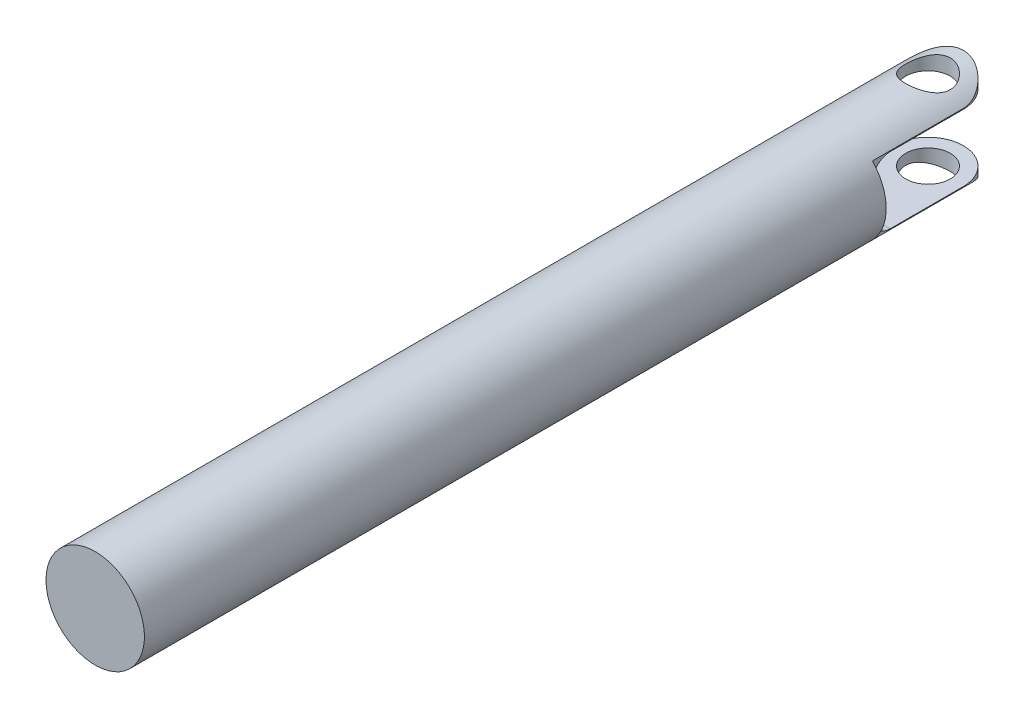
ISO-10303-21;
HEADER;
FILE_DESCRIPTION(('STEP AP214'),'2;1');
FILE_NAME('part.step','',(''),(''),'','','');
FILE_SCHEMA(('AUTOMOTIVE_DESIGN { 1 0 10303 214 1 1 1 1 }'));
ENDSEC;
DATA;
#1=APPLICATION_CONTEXT('core data for automotive mechanical design processes');
#2=APPLICATION_PROTOCOL_DEFINITION('international standard','automotive_design',2000,#1);
#3=PRODUCT_CONTEXT('',#1,'mechanical');
#4=PRODUCT('Part','Part','',(#3));
#5=PRODUCT_RELATED_PRODUCT_CATEGORY('part','',(#4));
#6=PRODUCT_DEFINITION_FORMATION('','',#4);
#7=PRODUCT_DEFINITION_CONTEXT('part definition',#1,'design');
#8=PRODUCT_DEFINITION('design','',#6,#7);
#9=PRODUCT_DEFINITION_SHAPE('','',#8);
#10=(LENGTH_UNIT() NAMED_UNIT(*) SI_UNIT(.MILLI.,.METRE.));
#11=(NAMED_UNIT(*) PLANE_ANGLE_UNIT() SI_UNIT($,.RADIAN.));
#12=(NAMED_UNIT(*) SI_UNIT($,.STERADIAN.) SOLID_ANGLE_UNIT());
#13=UNCERTAINTY_MEASURE_WITH_UNIT(LENGTH_MEASURE(1.E-05),#10,'distance_accuracy_value','');
#14=(GEOMETRIC_REPRESENTATION_CONTEXT(3) GLOBAL_UNCERTAINTY_ASSIGNED_CONTEXT((#13)) GLOBAL_UNIT_ASSIGNED_CONTEXT((#10,
#11,#12)) REPRESENTATION_CONTEXT('',''));
#15=CARTESIAN_POINT('',(0.,0.,0.));
#16=DIRECTION('',(0.,0.,1.));
#17=DIRECTION('',(1.,0.,0.));
#18=AXIS2_PLACEMENT_3D('',#15,#16,#17);
#19=CARTESIAN_POINT('',(715.852281931826,264.343054411073,18.1189841955734));
#20=DIRECTION('',(0.,1.,0.));
#21=DIRECTION('',(0.,0.,1.));
#22=AXIS2_PLACEMENT_3D('',#19,#20,#21);
#23=PLANE('',#22);
#24=CARTESIAN_POINT('',(706.62430407127,264.343054411073,22.4955493916067));
#25=DIRECTION('',(0.,1.,0.));
#26=DIRECTION('',(0.,0.,1.));
#27=AXIS2_PLACEMENT_3D('',#24,#25,#26);
#28=CIRCLE('',#27,1.5875);
#29=CARTESIAN_POINT('',(706.62430407127,264.343054411073,24.0830493916067));
#30=VERTEX_POINT('',#29);
#31=EDGE_CURVE('E153',#30,#30,#28,.T.);
#32=ORIENTED_EDGE('',*,*,#31,.T.);
#33=EDGE_LOOP('',(#32));
#34=FACE_BOUND('',#33,.T.);
#35=DIRECTION('',(-1.,0.,0.));
#36=VECTOR('',#35,1.);
#37=CARTESIAN_POINT('',(715.852281931826,264.343054411073,27.7138377391523));
#38=LINE('',#37,#36);
#39=CARTESIAN_POINT('',(709.146192852539,264.343054411073,27.7138377391523));
#40=VERTEX_POINT('',#39);
#41=CARTESIAN_POINT('',(704.10241529,264.343054411073,27.7138377391523));
#42=VERTEX_POINT('',#41);
#43=EDGE_CURVE('E150',#40,#42,#38,.T.);
#44=ORIENTED_EDGE('',*,*,#43,.T.);
#45=DIRECTION('',(0.,0.,-1.));
#46=VECTOR('',#45,1.);
#47=CARTESIAN_POINT('',(704.10241529,264.343054411073,22.4955493916067));
#48=LINE('',#47,#46);
#49=CARTESIAN_POINT('',(704.10241529,264.343054411073,22.4955493916067));
#50=VERTEX_POINT('',#49);
#51=EDGE_CURVE('E226',#42,#50,#48,.T.);
#52=ORIENTED_EDGE('',*,*,#51,.T.);
#53=CARTESIAN_POINT('',(706.62430407127,264.343054411073,22.4955493916067));
#54=DIRECTION('',(0.,1.,0.));
#55=DIRECTION('',(0.,0.,1.));
#56=AXIS2_PLACEMENT_3D('',#53,#54,#55);
#57=CIRCLE('',#56,2.52188878126947);
#58=CARTESIAN_POINT('',(706.548691910645,264.343054411073,19.9747943804526));
#59=VERTEX_POINT('',#58);
#60=EDGE_CURVE('E232',#50,#59,#57,.F.);
#61=ORIENTED_EDGE('',*,*,#60,.T.);
#62=DIRECTION('',(1.,0.,0.));
#63=VECTOR('',#62,1.);
#64=CARTESIAN_POINT('',(706.62430407127,264.343054411073,19.9747943804526));
#65=LINE('',#64,#63);
#66=CARTESIAN_POINT('',(706.699916231894,264.343054411073,19.9747943804526));
#67=VERTEX_POINT('',#66);
#68=EDGE_CURVE('E132',#59,#67,#65,.T.);
#69=ORIENTED_EDGE('',*,*,#68,.T.);
#70=CARTESIAN_POINT('',(706.62430407127,264.343054411073,22.4955493916067));
#71=DIRECTION('',(0.,1.,0.));
#72=DIRECTION('',(0.,0.,1.));
#73=AXIS2_PLACEMENT_3D('',#70,#71,#72);
#74=CIRCLE('',#73,2.52188878126947);
#75=CARTESIAN_POINT('',(709.146192852539,264.343054411073,22.4955493916067));
#76=VERTEX_POINT('',#75);
#77=EDGE_CURVE('E20',#67,#76,#74,.F.);
#78=ORIENTED_EDGE('',*,*,#77,.T.);
#79=DIRECTION('',(0.,0.,1.));
#80=VECTOR('',#79,1.);
#81=CARTESIAN_POINT('',(709.146192852539,264.343054411073,28.9838377391524));
#82=LINE('',#81,#80);
#83=EDGE_CURVE('E120',#76,#40,#82,.T.);
#84=ORIENTED_EDGE('',*,*,#83,.T.);
#85=EDGE_LOOP('',(#44,#52,#61,#69,#78,#84));
#86=FACE_BOUND('',#85,.T.);
#87=ADVANCED_FACE('F17',(#34,#86),#23,.F.);
#88=CARTESIAN_POINT('',(709.146192852539,252.498307150052,28.9838377391524));
#89=DIRECTION('',(-1.,0.,0.));
#90=DIRECTION('',(0.,0.,1.));
#91=AXIS2_PLACEMENT_3D('',#88,#89,#90);
#92=PLANE('',#91);
#93=ORIENTED_EDGE('',*,*,#83,.F.);
#94=DIRECTION('',(0.,1.,0.));
#95=VECTOR('',#94,1.);
#96=CARTESIAN_POINT('',(709.146192852539,252.498307150052,22.4955493916067));
#97=LINE('',#96,#95);
#98=CARTESIAN_POINT('',(709.146192852539,264.401909531112,22.4955493916067));
#99=VERTEX_POINT('',#98);
#100=EDGE_CURVE('E123',#76,#99,#97,.T.);
#101=ORIENTED_EDGE('',*,*,#100,.T.);
#102=DIRECTION('',(0.,0.,-1.));
#103=VECTOR('',#102,1.);
#104=CARTESIAN_POINT('',(709.146192852539,264.401909531112,81.8847543804526));
#105=LINE('',#104,#103);
#106=CARTESIAN_POINT('',(709.146192852539,264.401909531112,28.9838377391524));
#107=VERTEX_POINT('',#106);
#108=EDGE_CURVE('E247',#107,#99,#105,.T.);
#109=ORIENTED_EDGE('',*,*,#108,.F.);
#110=DIRECTION('',(0.,1.,0.));
#111=VECTOR('',#110,1.);
#112=CARTESIAN_POINT('',(709.146192852539,252.498307150052,28.9838377391523));
#113=LINE('',#112,#111);
#114=CARTESIAN_POINT('',(709.146192852539,263.073054411073,28.9838377391523));
#115=VERTEX_POINT('',#114);
#116=EDGE_CURVE('E129',#115,#107,#113,.T.);
#117=ORIENTED_EDGE('',*,*,#116,.F.);
#118=CARTESIAN_POINT('',(709.146192852539,263.073054411073,27.7138377391523));
#119=DIRECTION('',(-1.,0.,0.));
#120=DIRECTION('',(0.,0.,1.));
#121=AXIS2_PLACEMENT_3D('',#118,#119,#120);
#122=CIRCLE('',#121,1.27000000000001);
#123=EDGE_CURVE('E126',#115,#40,#122,.T.);
#124=ORIENTED_EDGE('',*,*,#123,.T.);
#125=EDGE_LOOP('',(#93,#101,#109,#117,#124));
#126=FACE_BOUND('',#125,.T.);
#127=ADVANCED_FACE('F121',(#126),#92,.F.);
#128=CARTESIAN_POINT('',(706.62430407127,264.343054411073,22.4955493916067));
#129=DIRECTION('',(0.,1.,0.));
#130=DIRECTION('',(0.,0.,1.));
#131=AXIS2_PLACEMENT_3D('',#128,#129,#130);
#132=CYLINDRICAL_SURFACE('',#131,2.52188878126947);
#133=DIRECTION('',(0.,1.,0.));
#134=VECTOR('',#133,1.);
#135=CARTESIAN_POINT('',(706.699916231894,261.961804411073,19.9747943804526));
#136=LINE('',#135,#134);
#137=CARTESIAN_POINT('',(706.699916231895,265.470125779349,19.9747943804526));
#138=VERTEX_POINT('',#137);
#139=EDGE_CURVE('E134',#67,#138,#136,.T.);
#140=ORIENTED_EDGE('',*,*,#139,.T.);
#141=CARTESIAN_POINT('',(709.146192852539,264.401909531112,22.4955493916067));
#142=CARTESIAN_POINT('',(709.146210846639,264.401867759245,22.4351059403807));
#143=CARTESIAN_POINT('',(709.144020695179,264.404154313488,22.3746900506629));
#144=CARTESIAN_POINT('',(709.135370540585,264.413059054684,22.2545887956424));
#145=CARTESIAN_POINT('',(709.128918010426,264.419669660335,22.1949023376706));
#146=CARTESIAN_POINT('',(709.111987828302,264.436799189149,22.0774084945787));
#147=CARTESIAN_POINT('',(709.101557951821,264.447271676336,22.0195873182296));
#148=CARTESIAN_POINT('',(709.076887639095,264.471619604504,21.9054932496051));
#149=CARTESIAN_POINT('',(709.062645700606,264.48549638686,21.8492209773792));
#150=CARTESIAN_POINT('',(709.014765941022,264.531173452414,21.6839462899591));
#151=CARTESIAN_POINT('',(708.975839821224,264.567166129655,21.5775931322377));
#152=CARTESIAN_POINT('',(708.885330500621,264.646094312908,21.372926656004));
#153=CARTESIAN_POINT('',(708.833704811736,264.689052956567,21.2746418345038));
#154=CARTESIAN_POINT('',(708.708195135422,264.786489406734,21.069241395572));
#155=CARTESIAN_POINT('',(708.631958694483,264.841625811675,20.9638695995181));
#156=CARTESIAN_POINT('',(708.464184491097,264.951618283822,20.7659156087025));
#157=CARTESIAN_POINT('',(708.372636449338,265.006474137014,20.6733420827264));
#158=CARTESIAN_POINT('',(708.156773478554,265.121396912518,20.4867557938782));
#159=CARTESIAN_POINT('',(708.029526922381,265.180610940894,20.3955130635561));
#160=CARTESIAN_POINT('',(707.825047919472,265.259927986,20.2764598039438));
#161=CARTESIAN_POINT('',(707.75467884761,265.284767683646,20.2397650527835));
#162=CARTESIAN_POINT('',(707.6097707179,265.330579268079,20.172806980718));
#163=CARTESIAN_POINT('',(707.535235392429,265.351554546691,20.1425380162716));
#164=CARTESIAN_POINT('',(707.399177849029,265.384872573456,20.0948191323584));
#165=CARTESIAN_POINT('',(707.338343366746,265.398100832177,20.0760128449909));
#166=CARTESIAN_POINT('',(707.214879682694,265.421457818205,20.0429537513668));
#167=CARTESIAN_POINT('',(707.152251091106,265.431587585946,20.0286994165518));
#168=CARTESIAN_POINT('',(707.02514241806,265.448565058508,20.0048747814631));
#169=CARTESIAN_POINT('',(706.960651578126,265.455386041103,19.995342605341));
#170=CARTESIAN_POINT('',(706.830790265802,265.465470506049,19.9812747772127));
#171=CARTESIAN_POINT('',(706.765418998562,265.468730520379,19.9767439960125));
#172=CARTESIAN_POINT('',(706.699916231895,265.470125779349,19.9747943804526));
#173=B_SPLINE_CURVE_WITH_KNOTS('',3,(#141,#142,#143,#144,#145,#146,#147,#148,#149,#150,#151,
#152,#153,#154,#155,#156,#157,#158,#159,#160,#161,#162,#163,#164,#165,#166,#167,#168,#169,#170,
#171,#172),.UNSPECIFIED.,.F.,.F.,(4,2,2,2,2,2,2,2,2,2,2,2,2,2,2,4),(0.,0.18120320027378,
0.362089547945063,0.540868263792676,0.719717536175043,1.07470774756271,1.43090217544286,
1.85316975117854,2.27572195897852,2.77472624456074,3.0238490126667,3.27275207149792,
3.46762018297402,3.66242278821265,3.85877348575763,4.05531523893904),.UNSPECIFIED.);
#174=EDGE_CURVE('E137',#99,#138,#173,.T.);
#175=ORIENTED_EDGE('',*,*,#174,.F.);
#176=ORIENTED_EDGE('',*,*,#100,.F.);
#177=ORIENTED_EDGE('',*,*,#77,.F.);
#178=EDGE_LOOP('',(#140,#175,#176,#177));
#179=FACE_BOUND('',#178,.T.);
#180=ADVANCED_FACE('F135',(#179),#132,.T.);
#181=CARTESIAN_POINT('',(706.62430407127,261.961804411073,19.9747943804526));
#182=DIRECTION('',(0.,0.,1.));
#183=DIRECTION('',(1.,0.,0.));
#184=AXIS2_PLACEMENT_3D('',#181,#182,#183);
#185=PLANE('',#184);
#186=DIRECTION('',(0.,1.,0.));
#187=VECTOR('',#186,1.);
#188=CARTESIAN_POINT('',(706.548691910646,252.498307150052,19.9747943804526));
#189=LINE('',#188,#187);
#190=CARTESIAN_POINT('',(706.548691910645,265.470125779349,19.9747943804526));
#191=VERTEX_POINT('',#190);
#192=EDGE_CURVE('E154',#59,#191,#189,.T.);
#193=ORIENTED_EDGE('',*,*,#192,.T.);
#194=CARTESIAN_POINT('',(706.62430407127,261.961804411073,19.9747943804526));
#195=DIRECTION('',(0.,0.,-1.));
#196=DIRECTION('',(-1.,0.,0.));
#197=AXIS2_PLACEMENT_3D('',#194,#195,#196);
#198=CIRCLE('',#197,3.509136079142);
#199=EDGE_CURVE('E202',#138,#191,#198,.F.);
#200=ORIENTED_EDGE('',*,*,#199,.F.);
#201=ORIENTED_EDGE('',*,*,#139,.F.);
#202=ORIENTED_EDGE('',*,*,#68,.F.);
#203=EDGE_LOOP('',(#193,#200,#201,#202));
#204=FACE_BOUND('',#203,.T.);
#205=ADVANCED_FACE('F209',(#204),#185,.F.);
#206=CARTESIAN_POINT('',(706.62430407127,264.343054411073,22.4955493916067));
#207=DIRECTION('',(0.,1.,0.));
#208=DIRECTION('',(0.,0.,1.));
#209=AXIS2_PLACEMENT_3D('',#206,#207,#208);
#210=CYLINDRICAL_SURFACE('',#209,2.52188878126947);
#211=DIRECTION('',(0.,1.,0.));
#212=VECTOR('',#211,1.);
#213=CARTESIAN_POINT('',(704.10241529,252.498307150052,22.4955493916067));
#214=LINE('',#213,#212);
#215=CARTESIAN_POINT('',(704.10241529,264.401909531112,22.4955493916067));
#216=VERTEX_POINT('',#215);
#217=EDGE_CURVE('E233',#50,#216,#214,.T.);
#218=ORIENTED_EDGE('',*,*,#217,.T.);
#219=CARTESIAN_POINT('',(706.548691910644,265.470125779349,19.9747943804526));
#220=CARTESIAN_POINT('',(706.485367772663,265.468775163411,19.9766808403384));
#221=CARTESIAN_POINT('',(706.422166223794,265.465684075923,19.9809774131935));
#222=CARTESIAN_POINT('',(706.296554611758,265.456164779915,19.9942553860524));
#223=CARTESIAN_POINT('',(706.234144020111,265.449738934613,20.0032334684656));
#224=CARTESIAN_POINT('',(706.110977998598,265.433744671081,20.0256677122464));
#225=CARTESIAN_POINT('',(706.050214354919,265.424197306183,20.0390938810031));
#226=CARTESIAN_POINT('',(705.930346651275,265.402179116675,20.0702277092493));
#227=CARTESIAN_POINT('',(705.871242813756,265.389707902288,20.0879359395903));
#228=CARTESIAN_POINT('',(705.69728655396,265.348367971547,20.1470386361362));
#229=CARTESIAN_POINT('',(705.585366874782,265.315515368032,20.1944901516153));
#230=CARTESIAN_POINT('',(705.371555590756,265.241668732653,20.3035173812863));
#231=CARTESIAN_POINT('',(705.269676607208,265.200664644671,20.3651105560942));
#232=CARTESIAN_POINT('',(705.067541581397,265.108870931517,20.507294679052));
#233=CARTESIAN_POINT('',(704.96844602199,265.057514320313,20.5891631361369));
#234=CARTESIAN_POINT('',(704.784316143431,264.951750180262,20.7661753154863));
#235=CARTESIAN_POINT('',(704.69931620924,264.897335612065,20.861350486366));
#236=CARTESIAN_POINT('',(704.576092048572,264.811712446467,21.0223197583642));
#237=CARTESIAN_POINT('',(704.532959244788,264.780118700004,21.0842015986885));
#238=CARTESIAN_POINT('',(704.452133081701,264.71830644032,21.212064165544));
#239=CARTESIAN_POINT('',(704.414441882716,264.688088476528,21.2780465051844));
#240=CARTESIAN_POINT('',(704.310350691054,264.601449167197,21.4813678006669));
#241=CARTESIAN_POINT('',(704.252287730166,264.548569560754,21.6249157510598));
#242=CARTESIAN_POINT('',(704.190606394839,264.489987165675,21.8318116915011));
#243=CARTESIAN_POINT('',(704.175596274476,264.475408246212,21.8894570547283));
#244=CARTESIAN_POINT('',(704.149581866782,264.449798434764,22.0064115563498));
#245=CARTESIAN_POINT('',(704.138575145388,264.438765387369,22.0657196600917));
#246=CARTESIAN_POINT('',(704.120690237221,264.42069222051,22.1863586016849));
#247=CARTESIAN_POINT('',(704.113866719049,264.413705037583,22.2477056157815));
#248=CARTESIAN_POINT('',(704.104714661813,264.404285739881,22.3712063772439));
#249=CARTESIAN_POINT('',(704.102395607047,264.401863236512,22.4333615499992));
#250=CARTESIAN_POINT('',(704.10241529,264.401909531112,22.4955493916067));
#251=B_SPLINE_CURVE_WITH_KNOTS('',3,(#219,#220,#221,#222,#223,#224,#225,#226,#227,#228,#229,
#230,#231,#232,#233,#234,#235,#236,#237,#238,#239,#240,#241,#242,#243,#244,#245,#246,#247,#248,
#249,#250),.UNSPECIFIED.,.F.,.F.,(4,2,2,2,2,2,2,2,2,2,2,2,2,2,2,4),(0.,0.190010508382326,
0.37988654686477,0.568507494909452,0.757153602326619,1.13316143011061,1.50963603298845,
1.92340399741726,2.33816691742723,2.58322234062998,2.82837478486535,3.31525113685259,
3.49904016859202,3.68271726922967,3.86874627038612,4.05516653906208),.UNSPECIFIED.);
#252=EDGE_CURVE('E195',#191,#216,#251,.T.);
#253=ORIENTED_EDGE('',*,*,#252,.F.);
#254=ORIENTED_EDGE('',*,*,#192,.F.);
#255=ORIENTED_EDGE('',*,*,#60,.F.);
#256=EDGE_LOOP('',(#218,#253,#254,#255));
#257=FACE_BOUND('',#256,.T.);
#258=ADVANCED_FACE('F203',(#257),#210,.T.);
#259=CARTESIAN_POINT('',(704.10241529,252.498307150052,22.4955493916067));
#260=DIRECTION('',(1.,0.,0.));
#261=DIRECTION('',(0.,0.,-1.));
#262=AXIS2_PLACEMENT_3D('',#259,#260,#261);
#263=PLANE('',#262);
#264=CARTESIAN_POINT('',(704.10241529,263.073054411073,27.7138377391523));
#265=DIRECTION('',(-1.,0.,0.));
#266=DIRECTION('',(0.,0.,1.));
#267=AXIS2_PLACEMENT_3D('',#264,#265,#266);
#268=CIRCLE('',#267,1.27000000000001);
#269=CARTESIAN_POINT('',(704.10241529,263.073054411073,28.9838377391523));
#270=VERTEX_POINT('',#269);
#271=EDGE_CURVE('E152',#42,#270,#268,.F.);
#272=ORIENTED_EDGE('',*,*,#271,.T.);
#273=DIRECTION('',(0.,1.,0.));
#274=VECTOR('',#273,1.);
#275=CARTESIAN_POINT('',(704.10241529,252.498307150052,28.9838377391523));
#276=LINE('',#275,#274);
#277=CARTESIAN_POINT('',(704.10241529,264.401909531112,28.9838377391523));
#278=VERTEX_POINT('',#277);
#279=EDGE_CURVE('E229',#278,#270,#276,.F.);
#280=ORIENTED_EDGE('',*,*,#279,.F.);
#281=DIRECTION('',(0.,0.,-1.));
#282=VECTOR('',#281,1.);
#283=CARTESIAN_POINT('',(704.10241529,264.401909531112,81.8847543804526));
#284=LINE('',#283,#282);
#285=EDGE_CURVE('E201',#216,#278,#284,.F.);
#286=ORIENTED_EDGE('',*,*,#285,.F.);
#287=ORIENTED_EDGE('',*,*,#217,.F.);
#288=ORIENTED_EDGE('',*,*,#51,.F.);
#289=EDGE_LOOP('',(#272,#280,#286,#287,#288));
#290=FACE_BOUND('',#289,.T.);
#291=ADVANCED_FACE('F208',(#290),#263,.F.);
#292=CARTESIAN_POINT('',(706.62430407127,252.498307150052,22.4955493916067));
#293=DIRECTION('',(0.,1.,0.));
#294=DIRECTION('',(0.,0.,1.));
#295=AXIS2_PLACEMENT_3D('',#292,#293,#294);
#296=CYLINDRICAL_SURFACE('',#295,1.5875);
#297=CARTESIAN_POINT('',(705.03680407127,265.091321909336,22.4955493916067));
#298=CARTESIAN_POINT('',(705.036809297307,265.091327908607,22.4115820058948));
#299=CARTESIAN_POINT('',(705.043502683489,265.094747820734,22.327551788926));
#300=CARTESIAN_POINT('',(705.069963580269,265.10795563778,22.1620388173801));
#301=CARTESIAN_POINT('',(705.089748899335,265.117752216343,22.0805596912883));
#302=CARTESIAN_POINT('',(705.141425383632,265.142356986035,21.922754700116));
#303=CARTESIAN_POINT('',(705.173266355512,265.157144370742,21.8464089934469));
#304=CARTESIAN_POINT('',(705.247993568841,265.190034031202,21.7001389753699));
#305=CARTESIAN_POINT('',(705.290881529738,265.208136822866,21.6302156658998));
#306=CARTESIAN_POINT('',(705.389849989792,265.247100037533,21.4936219615741));
#307=CARTESIAN_POINT('',(705.446620210057,265.268063883843,21.4274805991702));
#308=CARTESIAN_POINT('',(705.570296101999,265.309543409977,21.3052611316833));
#309=CARTESIAN_POINT('',(705.637205500741,265.33005892181,21.249186743751));
#310=CARTESIAN_POINT('',(705.783590829141,265.369630057491,21.1458092699024));
#311=CARTESIAN_POINT('',(705.863543626755,265.388551479213,21.0991253356223));
#312=CARTESIAN_POINT('',(706.031182160602,265.421503935707,21.0201051392256));
#313=CARTESIAN_POINT('',(706.118863917745,265.435537468691,20.9877615454125));
#314=CARTESIAN_POINT('',(706.29388652581,265.456393658141,20.9403324308913));
#315=CARTESIAN_POINT('',(706.380931554506,265.463598784059,20.9243270456709));
#316=CARTESIAN_POINT('',(706.556749177441,265.471391374626,20.9070329581297));
#317=CARTESIAN_POINT('',(706.645520918942,265.471982026685,20.9057371674811));
#318=CARTESIAN_POINT('',(706.815493128911,265.46668670082,20.9174683973777));
#319=CARTESIAN_POINT('',(706.896781070098,265.461260844712,20.9294778234641));
#320=CARTESIAN_POINT('',(707.056041431706,265.445200276084,20.9657031416353));
#321=CARTESIAN_POINT('',(707.134013612477,265.434565187753,20.9899199144009));
#322=CARTESIAN_POINT('',(707.285873516932,265.408888368911,21.0501227596505));
#323=CARTESIAN_POINT('',(707.359681307853,265.393782219417,21.0862818471544));
#324=CARTESIAN_POINT('',(707.500372726207,265.360594219389,21.1691511774781));
#325=CARTESIAN_POINT('',(707.567253987663,265.34251135749,21.2158650083841));
#326=CARTESIAN_POINT('',(707.697949477332,265.303412206666,21.3228856485243));
#327=CARTESIAN_POINT('',(707.761079249012,265.282276953335,21.3839857911276));
#328=CARTESIAN_POINT('',(707.876539306098,265.240481312105,21.5158802802252));
#329=CARTESIAN_POINT('',(707.928861375083,265.219821296025,21.586681934654));
#330=CARTESIAN_POINT('',(708.023455508569,265.18036907689,21.7399049865195));
#331=CARTESIAN_POINT('',(708.065169043752,265.161702844518,21.8227060152369));
#332=CARTESIAN_POINT('',(708.133716424506,265.129951807389,21.9951541494402));
#333=CARTESIAN_POINT('',(708.160582907213,265.116854775025,22.0847857419107));
#334=CARTESIAN_POINT('',(708.190128588758,265.102244210038,22.2286915851946));
#335=CARTESIAN_POINT('',(708.19823938785,265.098171811196,22.2816458992678));
#336=CARTESIAN_POINT('',(708.209078647824,265.09270881908,22.3882414098064));
#337=CARTESIAN_POINT('',(708.211807411433,265.091318074969,22.4418825674676));
#338=CARTESIAN_POINT('',(708.211798845232,265.091327908607,22.5795167773186));
#339=CARTESIAN_POINT('',(708.20510545905,265.094747820734,22.6635469942873));
#340=CARTESIAN_POINT('',(708.17864456227,265.10795563778,22.8290599658333));
#341=CARTESIAN_POINT('',(708.158859243204,265.117752216343,22.9105390919251));
#342=CARTESIAN_POINT('',(708.107182758908,265.142356986035,23.0683440830974));
#343=CARTESIAN_POINT('',(708.075341787027,265.157144370742,23.1446897897665));
#344=CARTESIAN_POINT('',(708.000614573699,265.190034031202,23.2909598078435));
#345=CARTESIAN_POINT('',(707.957726612801,265.208136822866,23.3608831173135));
#346=CARTESIAN_POINT('',(707.858758152748,265.247100037533,23.4974768216393));
#347=CARTESIAN_POINT('',(707.801987932482,265.268063883843,23.5636181840432));
#348=CARTESIAN_POINT('',(707.67831204054,265.309543409977,23.6858376515301));
#349=CARTESIAN_POINT('',(707.611402641799,265.33005892181,23.7419120394623));
#350=CARTESIAN_POINT('',(707.465017313398,265.369630057491,23.845289513311));
#351=CARTESIAN_POINT('',(707.385064515784,265.388551479213,23.8919734475911));
#352=CARTESIAN_POINT('',(707.217425981937,265.421503935707,23.9709936439878));
#353=CARTESIAN_POINT('',(707.129744224795,265.435537468691,24.0033372378009));
#354=CARTESIAN_POINT('',(706.95472161673,265.456393658141,24.0507663523221));
#355=CARTESIAN_POINT('',(706.867676588033,265.463598784059,24.0667717375424));
#356=CARTESIAN_POINT('',(706.691858965099,265.471391374626,24.0840658250836));
#357=CARTESIAN_POINT('',(706.603087223597,265.471982026685,24.0853616157322));
#358=CARTESIAN_POINT('',(706.433115013628,265.46668670082,24.0736303858357));
#359=CARTESIAN_POINT('',(706.351827072441,265.461260844712,24.0616209597493));
#360=CARTESIAN_POINT('',(706.192566710833,265.445200276084,24.025395641578));
#361=CARTESIAN_POINT('',(706.114594530063,265.434565187753,24.0011788688125));
#362=CARTESIAN_POINT('',(705.962734625608,265.408888368911,23.9409760235629));
#363=CARTESIAN_POINT('',(705.888926834686,265.393782219417,23.904816936059));
#364=CARTESIAN_POINT('',(705.748235416332,265.360594219389,23.8219476057353));
#365=CARTESIAN_POINT('',(705.681354154877,265.34251135749,23.7752337748292));
#366=CARTESIAN_POINT('',(705.550658665208,265.303412206666,23.668213134689));
#367=CARTESIAN_POINT('',(705.487528893528,265.282276953335,23.6071129920857));
#368=CARTESIAN_POINT('',(705.372068836441,265.240481312105,23.4752185029881));
#369=CARTESIAN_POINT('',(705.319746767456,265.219821296025,23.4044168485593));
#370=CARTESIAN_POINT('',(705.22515263397,265.18036907689,23.2511937966939));
#371=CARTESIAN_POINT('',(705.183439098787,265.161702844518,23.1683927679765));
#372=CARTESIAN_POINT('',(705.114891718033,265.129951807389,22.995944633773));
#373=CARTESIAN_POINT('',(705.088025235326,265.116854775025,22.9063130413026));
#374=CARTESIAN_POINT('',(705.058479553781,265.102244210038,22.7624071980187));
#375=CARTESIAN_POINT('',(705.05036875469,265.098171811196,22.7094528839455));
#376=CARTESIAN_POINT('',(705.039529494716,265.09270881908,22.6028573734069));
#377=CARTESIAN_POINT('',(705.036800731106,265.091318074969,22.5492162157457));
#378=CARTESIAN_POINT('',(705.03680407127,265.091321909336,22.4955493916067));
#379=B_SPLINE_CURVE_WITH_KNOTS('',3,(#297,#298,#299,#300,#301,#302,#303,#304,#305,#306,#307,
#308,#309,#310,#311,#312,#313,#314,#315,#316,#317,#318,#319,#320,#321,#322,#323,#324,#325,#326,
#327,#328,#329,#330,#331,#332,#333,#334,#335,#336,#337,#338,#339,#340,#341,#342,#343,#344,#345,
#346,#347,#348,#349,#350,#351,#352,#353,#354,#355,#356,#357,#358,#359,#360,#361,#362,#363,#364,
#365,#366,#367,#368,#369,#370,#371,#372,#373,#374,#375,#376,#377,#378),.UNSPECIFIED.,.T.,.F.,(4,
2,2,2,2,2,2,2,2,2,2,2,2,2,2,2,2,2,2,2,2,2,2,2,2,2,2,2,2,2,2,2,2,2,2,2,2,2,2,2,4),(0.,
0.251687633919703,0.503718334889148,0.754711051038043,1.00574285749613,1.27353807023167,
1.54143196176887,1.82346518897505,2.10535405606965,2.37031237069136,2.63514300054715,
2.88103565783032,3.12694605721051,3.37658798087479,3.62631489836888,3.89621968903549,
4.1663289223132,4.44859905380822,4.73024619896211,4.89111861020772,5.05198197248844,
5.30366960640816,5.55570030737762,5.8066930235265,6.05772482998459,6.32552004272013,
6.59341393425732,6.8754471614635,7.1573360285581,7.4222943431798,7.6871249730356,
7.93301763031876,8.17892802969896,8.42856995336324,8.67829687085747,8.94820166152393,
9.21831089480172,9.50058102629674,9.78222817145066,9.94310058269623,10.1039639449769),.UNSPECIFIED.);
#380=CARTESIAN_POINT('',(705.03680407127,265.091321909336,22.4955493916067));
#381=VERTEX_POINT('',#380);
#382=EDGE_CURVE('E181',#381,#381,#379,.T.);
#383=ORIENTED_EDGE('',*,*,#382,.F.);
#384=EDGE_LOOP('',(#383));
#385=FACE_BOUND('',#384,.T.);
#386=ORIENTED_EDGE('',*,*,#31,.F.);
#387=EDGE_LOOP('',(#386));
#388=FACE_BOUND('',#387,.T.);
#389=ADVANCED_FACE('F320',(#385,#388),#296,.F.);
#390=CARTESIAN_POINT('',(715.852281931826,263.073054411073,27.7138377391523));
#391=DIRECTION('',(-1.,0.,0.));
#392=DIRECTION('',(0.,0.,1.));
#393=AXIS2_PLACEMENT_3D('',#390,#391,#392);
#394=CYLINDRICAL_SURFACE('',#393,1.27000000000001);
#395=DIRECTION('',(1.,0.,0.));
#396=VECTOR('',#395,1.);
#397=CARTESIAN_POINT('',(720.175677525395,263.073054411073,28.9838377391523));
#398=LINE('',#397,#396);
#399=EDGE_CURVE('E145',#115,#270,#398,.F.);
#400=ORIENTED_EDGE('',*,*,#399,.T.);
#401=ORIENTED_EDGE('',*,*,#271,.F.);
#402=ORIENTED_EDGE('',*,*,#43,.F.);
#403=ORIENTED_EDGE('',*,*,#123,.F.);
#404=EDGE_LOOP('',(#400,#401,#402,#403));
#405=FACE_BOUND('',#404,.T.);
#406=ADVANCED_FACE('F317',(#405),#394,.F.);
#407=CARTESIAN_POINT('',(715.852281931826,260.850554411073,27.7138377391523));
#408=DIRECTION('',(-1.,0.,0.));
#409=DIRECTION('',(0.,0.,1.));
#410=AXIS2_PLACEMENT_3D('',#407,#408,#409);
#411=CYLINDRICAL_SURFACE('',#410,1.27);
#412=DIRECTION('',(1.,0.,0.));
#413=VECTOR('',#412,1.);
#414=CARTESIAN_POINT('',(715.852281931826,259.580554411073,27.7138377391523));
#415=LINE('',#414,#413);
#416=CARTESIAN_POINT('',(709.146192852539,259.580554411073,27.7138377391523));
#417=VERTEX_POINT('',#416);
#418=CARTESIAN_POINT('',(704.10241529,259.580554411073,27.7138377391523));
#419=VERTEX_POINT('',#418);
#420=EDGE_CURVE('E245',#417,#419,#415,.F.);
#421=ORIENTED_EDGE('',*,*,#420,.T.);
#422=CARTESIAN_POINT('',(704.10241529,260.850554411073,27.7138377391523));
#423=DIRECTION('',(-1.,0.,0.));
#424=DIRECTION('',(0.,0.,1.));
#425=AXIS2_PLACEMENT_3D('',#422,#423,#424);
#426=CIRCLE('',#425,1.27);
#427=CARTESIAN_POINT('',(704.10241529,260.850554411073,28.9838377391524));
#428=VERTEX_POINT('',#427);
#429=EDGE_CURVE('E257',#419,#428,#426,.T.);
#430=ORIENTED_EDGE('',*,*,#429,.T.);
#431=DIRECTION('',(1.,0.,0.));
#432=VECTOR('',#431,1.);
#433=CARTESIAN_POINT('',(720.175677525395,260.850554411073,28.9838377391524));
#434=LINE('',#433,#432);
#435=CARTESIAN_POINT('',(709.146192852539,260.850554411073,28.9838377391524));
#436=VERTEX_POINT('',#435);
#437=EDGE_CURVE('E248',#428,#436,#434,.T.);
#438=ORIENTED_EDGE('',*,*,#437,.T.);
#439=CARTESIAN_POINT('',(709.146192852539,260.850554411073,27.7138377391523));
#440=DIRECTION('',(-1.,0.,0.));
#441=DIRECTION('',(0.,0.,1.));
#442=AXIS2_PLACEMENT_3D('',#439,#440,#441);
#443=CIRCLE('',#442,1.27);
#444=EDGE_CURVE('E149',#436,#417,#443,.F.);
#445=ORIENTED_EDGE('',*,*,#444,.T.);
#446=EDGE_LOOP('',(#421,#430,#438,#445));
#447=FACE_BOUND('',#446,.T.);
#448=ADVANCED_FACE('F313',(#447),#411,.F.);
#449=CARTESIAN_POINT('',(715.852281931826,259.580554411073,27.7138377391523));
#450=DIRECTION('',(0.,-1.,0.));
#451=DIRECTION('',(0.,0.,-1.));
#452=AXIS2_PLACEMENT_3D('',#449,#450,#451);
#453=PLANE('',#452);
#454=CARTESIAN_POINT('',(706.62430407127,259.580554411073,22.4955493916067));
#455=DIRECTION('',(0.,1.,0.));
#456=DIRECTION('',(0.,0.,1.));
#457=AXIS2_PLACEMENT_3D('',#454,#455,#456);
#458=CIRCLE('',#457,1.5875);
#459=CARTESIAN_POINT('',(706.62430407127,259.580554411073,24.0830493916067));
#460=VERTEX_POINT('',#459);
#461=EDGE_CURVE('E270',#460,#460,#458,.F.);
#462=ORIENTED_EDGE('',*,*,#461,.T.);
#463=EDGE_LOOP('',(#462));
#464=FACE_BOUND('',#463,.T.);
#465=CARTESIAN_POINT('',(706.62430407127,259.580554411073,22.4955493916067));
#466=DIRECTION('',(0.,1.,0.));
#467=DIRECTION('',(0.,0.,1.));
#468=AXIS2_PLACEMENT_3D('',#465,#466,#467);
#469=CIRCLE('',#468,2.52188878126947);
#470=CARTESIAN_POINT('',(709.146192852539,259.580554411073,22.4955493916067));
#471=VERTEX_POINT('',#470);
#472=CARTESIAN_POINT('',(706.699916231894,259.580554411073,19.9747943804526));
#473=VERTEX_POINT('',#472);
#474=EDGE_CURVE('E262',#471,#473,#469,.T.);
#475=ORIENTED_EDGE('',*,*,#474,.T.);
#476=DIRECTION('',(1.,0.,0.));
#477=VECTOR('',#476,1.);
#478=CARTESIAN_POINT('',(706.62430407127,259.580554411073,19.9747943804526));
#479=LINE('',#478,#477);
#480=CARTESIAN_POINT('',(706.548691910645,259.580554411073,19.9747943804526));
#481=VERTEX_POINT('',#480);
#482=EDGE_CURVE('E240',#473,#481,#479,.F.);
#483=ORIENTED_EDGE('',*,*,#482,.T.);
#484=CARTESIAN_POINT('',(706.62430407127,259.580554411073,22.4955493916067));
#485=DIRECTION('',(0.,1.,0.));
#486=DIRECTION('',(0.,0.,1.));
#487=AXIS2_PLACEMENT_3D('',#484,#485,#486);
#488=CIRCLE('',#487,2.52188878126947);
#489=CARTESIAN_POINT('',(704.10241529,259.580554411073,22.4955493916067));
#490=VERTEX_POINT('',#489);
#491=EDGE_CURVE('E259',#481,#490,#488,.T.);
#492=ORIENTED_EDGE('',*,*,#491,.T.);
#493=DIRECTION('',(0.,0.,-1.));
#494=VECTOR('',#493,1.);
#495=CARTESIAN_POINT('',(704.10241529,259.580554411073,22.4955493916067));
#496=LINE('',#495,#494);
#497=EDGE_CURVE('E253',#490,#419,#496,.F.);
#498=ORIENTED_EDGE('',*,*,#497,.T.);
#499=ORIENTED_EDGE('',*,*,#420,.F.);
#500=DIRECTION('',(0.,0.,1.));
#501=VECTOR('',#500,1.);
#502=CARTESIAN_POINT('',(709.146192852539,259.580554411073,28.9838377391524));
#503=LINE('',#502,#501);
#504=EDGE_CURVE('E265',#417,#471,#503,.F.);
#505=ORIENTED_EDGE('',*,*,#504,.T.);
#506=EDGE_LOOP('',(#475,#483,#492,#498,#499,#505));
#507=FACE_BOUND('',#506,.T.);
#508=ADVANCED_FACE('F309',(#464,#507),#453,.F.);
#509=CARTESIAN_POINT('',(706.62430407127,261.961804411073,81.8847543804526));
#510=DIRECTION('',(0.,0.,1.));
#511=DIRECTION('',(1.,0.,0.));
#512=AXIS2_PLACEMENT_3D('',#509,#510,#511);
#513=PLANE('',#512);
#514=CARTESIAN_POINT('',(706.62430407127,261.961804411073,81.8847543804526));
#515=DIRECTION('',(0.,0.,-1.));
#516=DIRECTION('',(-1.,0.,0.));
#517=AXIS2_PLACEMENT_3D('',#514,#515,#516);
#518=CIRCLE('',#517,3.509136079142);
#519=CARTESIAN_POINT('',(703.115167992128,261.961804411073,81.8847543804526));
#520=VERTEX_POINT('',#519);
#521=EDGE_CURVE('E342',#520,#520,#518,.T.);
#522=ORIENTED_EDGE('',*,*,#521,.F.);
#523=EDGE_LOOP('',(#522));
#524=FACE_BOUND('',#523,.T.);
#525=ADVANCED_FACE('F305',(#524),#513,.T.);
#526=CARTESIAN_POINT('',(704.10241529,252.498307150052,22.4955493916067));
#527=DIRECTION('',(1.,0.,0.));
#528=DIRECTION('',(0.,0.,-1.));
#529=AXIS2_PLACEMENT_3D('',#526,#527,#528);
#530=PLANE('',#529);
#531=DIRECTION('',(0.,1.,0.));
#532=VECTOR('',#531,1.);
#533=CARTESIAN_POINT('',(704.10241529,252.498307150052,22.4955493916067));
#534=LINE('',#533,#532);
#535=CARTESIAN_POINT('',(704.10241529,259.521699291033,22.4955493916067));
#536=VERTEX_POINT('',#535);
#537=EDGE_CURVE('E256',#490,#536,#534,.F.);
#538=ORIENTED_EDGE('',*,*,#537,.T.);
#539=DIRECTION('',(0.,0.,-1.));
#540=VECTOR('',#539,1.);
#541=CARTESIAN_POINT('',(704.10241529,259.521699291033,81.8847543804526));
#542=LINE('',#541,#540);
#543=CARTESIAN_POINT('',(704.10241529,259.521699291033,28.9838377391524));
#544=VERTEX_POINT('',#543);
#545=EDGE_CURVE('E271',#544,#536,#542,.T.);
#546=ORIENTED_EDGE('',*,*,#545,.F.);
#547=DIRECTION('',(0.,-1.,0.));
#548=VECTOR('',#547,1.);
#549=CARTESIAN_POINT('',(704.10241529,252.498307150052,28.9838377391524));
#550=LINE('',#549,#548);
#551=EDGE_CURVE('E148',#544,#428,#550,.F.);
#552=ORIENTED_EDGE('',*,*,#551,.T.);
#553=ORIENTED_EDGE('',*,*,#429,.F.);
#554=ORIENTED_EDGE('',*,*,#497,.F.);
#555=EDGE_LOOP('',(#538,#546,#552,#553,#554));
#556=FACE_BOUND('',#555,.T.);
#557=ADVANCED_FACE('F301',(#556),#530,.F.);
#558=CARTESIAN_POINT('',(706.62430407127,258.446720614587,22.4955493916067));
#559=DIRECTION('',(0.,1.,0.));
#560=DIRECTION('',(0.,0.,1.));
#561=AXIS2_PLACEMENT_3D('',#558,#559,#560);
#562=CYLINDRICAL_SURFACE('',#561,2.52188878126947);
#563=DIRECTION('',(0.,1.,0.));
#564=VECTOR('',#563,1.);
#565=CARTESIAN_POINT('',(706.548691910646,261.961804411073,19.9747943804526));
#566=LINE('',#565,#564);
#567=CARTESIAN_POINT('',(706.548691910646,258.453483042797,19.9747943804526));
#568=VERTEX_POINT('',#567);
#569=EDGE_CURVE('E244',#481,#568,#566,.F.);
#570=ORIENTED_EDGE('',*,*,#569,.T.);
#571=CARTESIAN_POINT('',(704.10241529,259.521699291033,22.4955493916067));
#572=CARTESIAN_POINT('',(704.1023972959,259.521741062901,22.4351059403808));
#573=CARTESIAN_POINT('',(704.10458744736,259.519454508657,22.3746900506629));
#574=CARTESIAN_POINT('',(704.113237601955,259.510549767462,22.2545887956424));
#575=CARTESIAN_POINT('',(704.119690132113,259.50393916181,22.1949023376706));
#576=CARTESIAN_POINT('',(704.136620314237,259.486809632996,22.0774084945788));
#577=CARTESIAN_POINT('',(704.147050190719,259.47633714581,22.0195873182296));
#578=CARTESIAN_POINT('',(704.171720503444,259.451989217641,21.9054932496052));
#579=CARTESIAN_POINT('',(704.185962441933,259.438112435285,21.8492209773793));
#580=CARTESIAN_POINT('',(704.233842201517,259.392435369732,21.6839462899591));
#581=CARTESIAN_POINT('',(704.272768321315,259.35644269249,21.5775931322377));
#582=CARTESIAN_POINT('',(704.363277641919,259.277514509237,21.3729266560041));
#583=CARTESIAN_POINT('',(704.414903330804,259.234555865578,21.2746418345038));
#584=CARTESIAN_POINT('',(704.540413007117,259.137119415412,21.069241395572));
#585=CARTESIAN_POINT('',(704.616649448056,259.081983010471,20.9638695995181));
#586=CARTESIAN_POINT('',(704.784423651442,258.971990538323,20.7659156087025));
#587=CARTESIAN_POINT('',(704.875971693201,258.917134685131,20.6733420827264));
#588=CARTESIAN_POINT('',(705.091834663986,258.802211909628,20.4867557938782));
#589=CARTESIAN_POINT('',(705.219081220158,258.742997881252,20.3955130635561));
#590=CARTESIAN_POINT('',(705.423560223067,258.663680836145,20.2764598039438));
#591=CARTESIAN_POINT('',(705.493929294929,258.638841138499,20.2397650527835));
#592=CARTESIAN_POINT('',(705.638837424639,258.593029554067,20.172806980718));
#593=CARTESIAN_POINT('',(705.713372750111,258.572054275455,20.1425380162717));
#594=CARTESIAN_POINT('',(705.849430293511,258.53873624869,20.0948191323585));
#595=CARTESIAN_POINT('',(705.910264775794,258.525507989968,20.0760128449909));
#596=CARTESIAN_POINT('',(706.033728459846,258.50215100394,20.0429537513667));
#597=CARTESIAN_POINT('',(706.096357051434,258.492021236199,20.0286994165517));
#598=CARTESIAN_POINT('',(706.22346572448,258.475043763637,20.004874781463));
#599=CARTESIAN_POINT('',(706.287956564415,258.468222781042,19.9953426053409));
#600=CARTESIAN_POINT('',(706.417817876738,258.458138316096,19.9812747772126));
#601=CARTESIAN_POINT('',(706.483189143979,258.454878301766,19.9767439960125));
#602=CARTESIAN_POINT('',(706.548691910645,258.453483042797,19.9747943804526));
#603=B_SPLINE_CURVE_WITH_KNOTS('',3,(#571,#572,#573,#574,#575,#576,#577,#578,#579,#580,#581,
#582,#583,#584,#585,#586,#587,#588,#589,#590,#591,#592,#593,#594,#595,#596,#597,#598,#599,#600,
#601,#602),.UNSPECIFIED.,.F.,.F.,(4,2,2,2,2,2,2,2,2,2,2,2,2,2,2,4),(0.,0.181203200273777,
0.362089547945067,0.540868263792683,0.71971753617504,1.07470774756271,1.43090217544285,
1.85316975117855,2.27572195897851,2.77472624456074,3.02384901266669,3.2727520714979,
3.46762018297436,3.66242278821332,3.85877348575863,4.05531523894036),.UNSPECIFIED.);
#604=EDGE_CURVE('E171',#536,#568,#603,.T.);
#605=ORIENTED_EDGE('',*,*,#604,.F.);
#606=ORIENTED_EDGE('',*,*,#537,.F.);
#607=ORIENTED_EDGE('',*,*,#491,.F.);
#608=EDGE_LOOP('',(#570,#605,#606,#607));
#609=FACE_BOUND('',#608,.T.);
#610=ADVANCED_FACE('F296',(#609),#562,.T.);
#611=CARTESIAN_POINT('',(706.62430407127,261.961804411073,19.9747943804526));
#612=DIRECTION('',(0.,0.,1.));
#613=DIRECTION('',(1.,0.,0.));
#614=AXIS2_PLACEMENT_3D('',#611,#612,#613);
#615=PLANE('',#614);
#616=DIRECTION('',(0.,1.,0.));
#617=VECTOR('',#616,1.);
#618=CARTESIAN_POINT('',(706.699916231894,252.498307150052,19.9747943804526));
#619=LINE('',#618,#617);
#620=CARTESIAN_POINT('',(706.699916231894,258.453483042797,19.9747943804526));
#621=VERTEX_POINT('',#620);
#622=EDGE_CURVE('E243',#473,#621,#619,.F.);
#623=ORIENTED_EDGE('',*,*,#622,.T.);
#624=CARTESIAN_POINT('',(706.62430407127,261.961804411073,19.9747943804526));
#625=DIRECTION('',(0.,0.,-1.));
#626=DIRECTION('',(-1.,0.,0.));
#627=AXIS2_PLACEMENT_3D('',#624,#625,#626);
#628=CIRCLE('',#627,3.509136079142);
#629=EDGE_CURVE('E280',#568,#621,#628,.F.);
#630=ORIENTED_EDGE('',*,*,#629,.F.);
#631=ORIENTED_EDGE('',*,*,#569,.F.);
#632=ORIENTED_EDGE('',*,*,#482,.F.);
#633=EDGE_LOOP('',(#623,#630,#631,#632));
#634=FACE_BOUND('',#633,.T.);
#635=ADVANCED_FACE('F293',(#634),#615,.F.);
#636=CARTESIAN_POINT('',(706.62430407127,258.446720614587,22.4955493916067));
#637=DIRECTION('',(0.,1.,0.));
#638=DIRECTION('',(0.,0.,1.));
#639=AXIS2_PLACEMENT_3D('',#636,#637,#638);
#640=CYLINDRICAL_SURFACE('',#639,2.52188878126947);
#641=DIRECTION('',(0.,1.,0.));
#642=VECTOR('',#641,1.);
#643=CARTESIAN_POINT('',(709.146192852539,252.498307150052,22.4955493916067));
#644=LINE('',#643,#642);
#645=CARTESIAN_POINT('',(709.146192852539,259.521699291033,22.4955493916067));
#646=VERTEX_POINT('',#645);
#647=EDGE_CURVE('E263',#471,#646,#644,.F.);
#648=ORIENTED_EDGE('',*,*,#647,.T.);
#649=CARTESIAN_POINT('',(706.699916231894,258.453483042797,19.9747943804526));
#650=CARTESIAN_POINT('',(706.763240369875,258.454833658734,19.9766808403384));
#651=CARTESIAN_POINT('',(706.826441918744,258.457924746222,19.9809774131934));
#652=CARTESIAN_POINT('',(706.952053530781,258.467444042231,19.9942553860524));
#653=CARTESIAN_POINT('',(707.014464122427,258.473869887532,20.0032334684655));
#654=CARTESIAN_POINT('',(707.13763014394,258.489864151064,20.0256677122462));
#655=CARTESIAN_POINT('',(707.198393787619,258.499411515963,20.0390938810029));
#656=CARTESIAN_POINT('',(707.318261491263,258.52142970547,20.070227709249));
#657=CARTESIAN_POINT('',(707.377365328782,258.533900919857,20.0879359395901));
#658=CARTESIAN_POINT('',(707.551321588578,258.575240850599,20.1470386361359));
#659=CARTESIAN_POINT('',(707.663241267756,258.608093454113,20.1944901516149));
#660=CARTESIAN_POINT('',(707.877052551782,258.681940089492,20.3035173812859));
#661=CARTESIAN_POINT('',(707.978931535331,258.722944177475,20.3651105560937));
#662=CARTESIAN_POINT('',(708.181066561142,258.814737890628,20.5072946790515));
#663=CARTESIAN_POINT('',(708.280162120549,258.866094501832,20.5891631361363));
#664=CARTESIAN_POINT('',(708.464291999107,258.971858641883,20.7661753154855));
#665=CARTESIAN_POINT('',(708.549291933299,259.02627321008,20.8613504863652));
#666=CARTESIAN_POINT('',(708.672516093967,259.111896375678,21.0223197583633));
#667=CARTESIAN_POINT('',(708.715648897751,259.143490122141,21.0842015986876));
#668=CARTESIAN_POINT('',(708.796475060838,259.205302381825,21.2120641655431));
#669=CARTESIAN_POINT('',(708.834166259823,259.235520345617,21.2780465051834));
#670=CARTESIAN_POINT('',(708.938257451485,259.322159654948,21.4813678006658));
#671=CARTESIAN_POINT('',(708.996320412372,259.375039261391,21.6249157510587));
#672=CARTESIAN_POINT('',(709.0580017477,259.43362165647,21.8318116915));
#673=CARTESIAN_POINT('',(709.073011868063,259.448200575934,21.8894570547273));
#674=CARTESIAN_POINT('',(709.099026275757,259.473810387382,22.006411556349));
#675=CARTESIAN_POINT('',(709.110032997152,259.484843434777,22.0657196600909));
#676=CARTESIAN_POINT('',(709.127917905318,259.502916601635,22.1863586016844));
#677=CARTESIAN_POINT('',(709.13474142349,259.509903784562,22.2477056157811));
#678=CARTESIAN_POINT('',(709.143893480726,259.519323082265,22.3712063772437));
#679=CARTESIAN_POINT('',(709.146212535493,259.521745585634,22.4333615499991));
#680=CARTESIAN_POINT('',(709.146192852539,259.521699291033,22.4955493916067));
#681=B_SPLINE_CURVE_WITH_KNOTS('',3,(#649,#650,#651,#652,#653,#654,#655,#656,#657,#658,#659,
#660,#661,#662,#663,#664,#665,#666,#667,#668,#669,#670,#671,#672,#673,#674,#675,#676,#677,#678,
#679,#680),.UNSPECIFIED.,.F.,.F.,(4,2,2,2,2,2,2,2,2,2,2,2,2,2,2,4),(0.,0.190010508382319,
0.37988654686463,0.568507494909061,0.757153602326554,1.13316143011046,1.50963603298831,
1.92340399741702,2.33816691742692,2.58322234062957,2.82837478486495,3.31525113685214,
3.4990401685919,3.68271726922989,3.86874627038667,4.05516653906296),.UNSPECIFIED.);
#682=EDGE_CURVE('E277',#621,#646,#681,.T.);
#683=ORIENTED_EDGE('',*,*,#682,.F.);
#684=ORIENTED_EDGE('',*,*,#622,.F.);
#685=ORIENTED_EDGE('',*,*,#474,.F.);
#686=EDGE_LOOP('',(#648,#683,#684,#685));
#687=FACE_BOUND('',#686,.T.);
#688=ADVANCED_FACE('F287',(#687),#640,.T.);
#689=CARTESIAN_POINT('',(709.146192852539,252.498307150052,28.9838377391524));
#690=DIRECTION('',(-1.,0.,0.));
#691=DIRECTION('',(0.,0.,1.));
#692=AXIS2_PLACEMENT_3D('',#689,#690,#691);
#693=PLANE('',#692);
#694=DIRECTION('',(0.,-1.,0.));
#695=VECTOR('',#694,1.);
#696=CARTESIAN_POINT('',(709.146192852539,252.498307150052,28.9838377391524));
#697=LINE('',#696,#695);
#698=CARTESIAN_POINT('',(709.146192852539,259.521699291033,28.9838377391524));
#699=VERTEX_POINT('',#698);
#700=EDGE_CURVE('E35',#436,#699,#697,.T.);
#701=ORIENTED_EDGE('',*,*,#700,.T.);
#702=DIRECTION('',(0.,0.,-1.));
#703=VECTOR('',#702,1.);
#704=CARTESIAN_POINT('',(709.146192852539,259.521699291033,81.8847543804526));
#705=LINE('',#704,#703);
#706=EDGE_CURVE('E275',#646,#699,#705,.F.);
#707=ORIENTED_EDGE('',*,*,#706,.F.);
#708=ORIENTED_EDGE('',*,*,#647,.F.);
#709=ORIENTED_EDGE('',*,*,#504,.F.);
#710=ORIENTED_EDGE('',*,*,#444,.F.);
#711=EDGE_LOOP('',(#701,#707,#708,#709,#710));
#712=FACE_BOUND('',#711,.T.);
#713=ADVANCED_FACE('F292',(#712),#693,.F.);
#714=CARTESIAN_POINT('',(720.175677525395,252.498307150052,28.9838377391524));
#715=DIRECTION('',(0.,0.,1.));
#716=DIRECTION('',(0.,-1.,0.));
#717=AXIS2_PLACEMENT_3D('',#714,#715,#716);
#718=PLANE('',#717);
#719=ORIENTED_EDGE('',*,*,#116,.T.);
#720=CARTESIAN_POINT('',(706.62430407127,261.961804411073,28.9838377391524));
#721=DIRECTION('',(0.,0.,-1.));
#722=DIRECTION('',(-1.,0.,0.));
#723=AXIS2_PLACEMENT_3D('',#720,#721,#722);
#724=CIRCLE('',#723,3.509136079142);
#725=EDGE_CURVE('E26',#699,#107,#724,.F.);
#726=ORIENTED_EDGE('',*,*,#725,.F.);
#727=ORIENTED_EDGE('',*,*,#700,.F.);
#728=ORIENTED_EDGE('',*,*,#437,.F.);
#729=ORIENTED_EDGE('',*,*,#551,.F.);
#730=CARTESIAN_POINT('',(706.62430407127,261.961804411073,28.9838377391524));
#731=DIRECTION('',(0.,0.,-1.));
#732=DIRECTION('',(-1.,0.,0.));
#733=AXIS2_PLACEMENT_3D('',#730,#731,#732);
#734=CIRCLE('',#733,3.509136079142);
#735=EDGE_CURVE('E274',#278,#544,#734,.F.);
#736=ORIENTED_EDGE('',*,*,#735,.F.);
#737=ORIENTED_EDGE('',*,*,#279,.T.);
#738=ORIENTED_EDGE('',*,*,#399,.F.);
#739=EDGE_LOOP('',(#719,#726,#727,#728,#729,#736,#737,#738));
#740=FACE_BOUND('',#739,.T.);
#741=ADVANCED_FACE('F350',(#740),#718,.F.);
#742=CARTESIAN_POINT('',(706.62430407127,252.498307150052,22.4955493916067));
#743=DIRECTION('',(0.,1.,0.));
#744=DIRECTION('',(0.,0.,1.));
#745=AXIS2_PLACEMENT_3D('',#742,#743,#744);
#746=CYLINDRICAL_SURFACE('',#745,1.5875);
#747=CARTESIAN_POINT('',(708.21180407127,258.832286912809,22.4955493916067));
#748=CARTESIAN_POINT('',(708.211798845232,258.832280913539,22.4115820058948));
#749=CARTESIAN_POINT('',(708.20510545905,258.828861001411,22.327551788926));
#750=CARTESIAN_POINT('',(708.17864456227,258.815653184366,22.1620388173801));
#751=CARTESIAN_POINT('',(708.158859243204,258.805856605803,22.0805596912883));
#752=CARTESIAN_POINT('',(708.107182758908,258.78125183611,21.922754700116));
#753=CARTESIAN_POINT('',(708.075341787027,258.766464451403,21.8464089934469));
#754=CARTESIAN_POINT('',(708.000614573699,258.733574790944,21.7001389753699));
#755=CARTESIAN_POINT('',(707.957726612801,258.715471999279,21.6302156658998));
#756=CARTESIAN_POINT('',(707.858758152748,258.676508784613,21.4936219615741));
#757=CARTESIAN_POINT('',(707.801987932482,258.655544938302,21.4274805991702));
#758=CARTESIAN_POINT('',(707.67831204054,258.614065412169,21.3052611316833));
#759=CARTESIAN_POINT('',(707.611402641799,258.593549900335,21.249186743751));
#760=CARTESIAN_POINT('',(707.465017313398,258.553978764654,21.1458092699024));
#761=CARTESIAN_POINT('',(707.385064515784,258.535057342933,21.0991253356223));
#762=CARTESIAN_POINT('',(707.217425981937,258.502104886439,21.0201051392256));
#763=CARTESIAN_POINT('',(707.129744224795,258.488071353455,20.9877615454125));
#764=CARTESIAN_POINT('',(706.95472161673,258.467215164005,20.9403324308913));
#765=CARTESIAN_POINT('',(706.867676588033,258.460010038086,20.9243270456709));
#766=CARTESIAN_POINT('',(706.691858965099,258.45221744752,20.9070329581297));
#767=CARTESIAN_POINT('',(706.603087223597,258.45162679546,20.9057371674811));
#768=CARTESIAN_POINT('',(706.433115013628,258.456922121326,20.9174683973777));
#769=CARTESIAN_POINT('',(706.351827072441,258.462347977433,20.9294778234641));
#770=CARTESIAN_POINT('',(706.192566710833,258.478408546061,20.9657031416353));
#771=CARTESIAN_POINT('',(706.114594530063,258.489043634392,20.9899199144009));
#772=CARTESIAN_POINT('',(705.962734625608,258.514720453234,21.0501227596505));
#773=CARTESIAN_POINT('',(705.888926834686,258.529826602729,21.0862818471544));
#774=CARTESIAN_POINT('',(705.748235416332,258.563014602757,21.1691511774781));
#775=CARTESIAN_POINT('',(705.681354154877,258.581097464655,21.2158650083841));
#776=CARTESIAN_POINT('',(705.550658665208,258.620196615479,21.3228856485243));
#777=CARTESIAN_POINT('',(705.487528893528,258.64133186881,21.3839857911276));
#778=CARTESIAN_POINT('',(705.372068836442,258.683127510041,21.5158802802252));
#779=CARTESIAN_POINT('',(705.319746767456,258.703787526121,21.586681934654));
#780=CARTESIAN_POINT('',(705.22515263397,258.743239745256,21.7399049865195));
#781=CARTESIAN_POINT('',(705.183439098787,258.761905977627,21.8227060152369));
#782=CARTESIAN_POINT('',(705.114891718033,258.793657014757,21.9951541494403));
#783=CARTESIAN_POINT('',(705.088025235326,258.80675404712,22.0847857419107));
#784=CARTESIAN_POINT('',(705.058479553781,258.821364612108,22.2286915851946));
#785=CARTESIAN_POINT('',(705.05036875469,258.82543701095,22.2816458992678));
#786=CARTESIAN_POINT('',(705.039529494716,258.830900003065,22.3882414098064));
#787=CARTESIAN_POINT('',(705.036800731106,258.832290747177,22.4418825674676));
#788=CARTESIAN_POINT('',(705.036809297307,258.832280913539,22.5795167773186));
#789=CARTESIAN_POINT('',(705.043502683489,258.828861001411,22.6635469942873));
#790=CARTESIAN_POINT('',(705.069963580269,258.815653184366,22.8290599658333));
#791=CARTESIAN_POINT('',(705.089748899335,258.805856605803,22.9105390919251));
#792=CARTESIAN_POINT('',(705.141425383632,258.78125183611,23.0683440830974));
#793=CARTESIAN_POINT('',(705.173266355512,258.766464451403,23.1446897897665));
#794=CARTESIAN_POINT('',(705.247993568841,258.733574790944,23.2909598078435));
#795=CARTESIAN_POINT('',(705.290881529738,258.715471999279,23.3608831173135));
#796=CARTESIAN_POINT('',(705.389849989792,258.676508784613,23.4974768216393));
#797=CARTESIAN_POINT('',(705.446620210057,258.655544938302,23.5636181840432));
#798=CARTESIAN_POINT('',(705.570296101999,258.614065412169,23.6858376515301));
#799=CARTESIAN_POINT('',(705.637205500741,258.593549900335,23.7419120394623));
#800=CARTESIAN_POINT('',(705.783590829141,258.553978764654,23.845289513311));
#801=CARTESIAN_POINT('',(705.863543626755,258.535057342933,23.8919734475911));
#802=CARTESIAN_POINT('',(706.031182160602,258.502104886439,23.9709936439878));
#803=CARTESIAN_POINT('',(706.118863917745,258.488071353455,24.0033372378009));
#804=CARTESIAN_POINT('',(706.29388652581,258.467215164005,24.0507663523221));
#805=CARTESIAN_POINT('',(706.380931554506,258.460010038086,24.0667717375424));
#806=CARTESIAN_POINT('',(706.556749177441,258.45221744752,24.0840658250837));
#807=CARTESIAN_POINT('',(706.645520918942,258.45162679546,24.0853616157322));
#808=CARTESIAN_POINT('',(706.815493128911,258.456922121326,24.0736303858357));
#809=CARTESIAN_POINT('',(706.896781070098,258.462347977433,24.0616209597493));
#810=CARTESIAN_POINT('',(707.056041431706,258.478408546061,24.025395641578));
#811=CARTESIAN_POINT('',(707.134013612477,258.489043634392,24.0011788688125));
#812=CARTESIAN_POINT('',(707.285873516932,258.514720453234,23.9409760235629));
#813=CARTESIAN_POINT('',(707.359681307853,258.529826602729,23.9048169360589));
#814=CARTESIAN_POINT('',(707.500372726207,258.563014602757,23.8219476057352));
#815=CARTESIAN_POINT('',(707.567253987663,258.581097464655,23.7752337748292));
#816=CARTESIAN_POINT('',(707.697949477332,258.620196615479,23.668213134689));
#817=CARTESIAN_POINT('',(707.761079249012,258.641331868811,23.6071129920857));
#818=CARTESIAN_POINT('',(707.876539306098,258.683127510041,23.4752185029881));
#819=CARTESIAN_POINT('',(707.928861375083,258.703787526121,23.4044168485593));
#820=CARTESIAN_POINT('',(708.023455508569,258.743239745256,23.2511937966939));
#821=CARTESIAN_POINT('',(708.065169043752,258.761905977627,23.1683927679765));
#822=CARTESIAN_POINT('',(708.133716424506,258.793657014757,22.995944633773));
#823=CARTESIAN_POINT('',(708.160582907213,258.80675404712,22.9063130413026));
#824=CARTESIAN_POINT('',(708.190128588758,258.821364612108,22.7624071980187));
#825=CARTESIAN_POINT('',(708.19823938785,258.82543701095,22.7094528839455));
#826=CARTESIAN_POINT('',(708.209078647824,258.830900003065,22.6028573734069));
#827=CARTESIAN_POINT('',(708.211807411433,258.832290747177,22.5492162157457));
#828=CARTESIAN_POINT('',(708.21180407127,258.832286912809,22.4955493916067));
#829=B_SPLINE_CURVE_WITH_KNOTS('',3,(#747,#748,#749,#750,#751,#752,#753,#754,#755,#756,#757,
#758,#759,#760,#761,#762,#763,#764,#765,#766,#767,#768,#769,#770,#771,#772,#773,#774,#775,#776,
#777,#778,#779,#780,#781,#782,#783,#784,#785,#786,#787,#788,#789,#790,#791,#792,#793,#794,#795,
#796,#797,#798,#799,#800,#801,#802,#803,#804,#805,#806,#807,#808,#809,#810,#811,#812,#813,#814,
#815,#816,#817,#818,#819,#820,#821,#822,#823,#824,#825,#826,#827,#828),.UNSPECIFIED.,.T.,.F.,(4,
2,2,2,2,2,2,2,2,2,2,2,2,2,2,2,2,2,2,2,2,2,2,2,2,2,2,2,2,2,2,2,2,2,2,2,2,2,2,2,4),(0.,
0.251687633919707,0.503718334889148,0.75471105103804,1.00574285749613,1.27353807023167,
1.54143196176887,1.82346518897505,2.10535405606965,2.37031237069135,2.63514300054715,
2.88103565783031,3.12694605721051,3.37658798087479,3.62631489836887,3.89621968903533,
4.1663289223132,4.44859905380821,4.73024619896211,4.89111861020772,5.05198197248843,
5.30366960640816,5.55570030737762,5.80669302352649,6.05772482998458,6.32552004272012,
6.59341393425732,6.87544716146349,7.15733602855809,7.4222943431798,7.68712497303559,
7.93301763031876,8.17892802969895,8.42856995336337,8.67829687085747,8.94820166152392,
9.21831089480171,9.50058102629673,9.78222817145065,9.94310058269622,10.1039639449769),.UNSPECIFIED.);
#830=CARTESIAN_POINT('',(708.21180407127,258.832286912809,22.4955493916067));
#831=VERTEX_POINT('',#830);
#832=EDGE_CURVE('E11',#831,#831,#829,.T.);
#833=ORIENTED_EDGE('',*,*,#832,.F.);
#834=EDGE_LOOP('',(#833));
#835=FACE_BOUND('',#834,.T.);
#836=ORIENTED_EDGE('',*,*,#461,.F.);
#837=EDGE_LOOP('',(#836));
#838=FACE_BOUND('',#837,.T.);
#839=ADVANCED_FACE('F161',(#835,#838),#746,.F.);
#840=CARTESIAN_POINT('',(706.62430407127,261.961804411073,81.8847543804526));
#841=DIRECTION('',(0.,0.,-1.));
#842=DIRECTION('',(-1.,0.,0.));
#843=AXIS2_PLACEMENT_3D('',#840,#841,#842);
#844=CYLINDRICAL_SURFACE('',#843,3.509136079142);
#845=ORIENTED_EDGE('',*,*,#521,.T.);
#846=EDGE_LOOP('',(#845));
#847=FACE_BOUND('',#846,.T.);
#848=ORIENTED_EDGE('',*,*,#832,.T.);
#849=EDGE_LOOP('',(#848));
#850=FACE_BOUND('',#849,.T.);
#851=ORIENTED_EDGE('',*,*,#706,.T.);
#852=ORIENTED_EDGE('',*,*,#725,.T.);
#853=ORIENTED_EDGE('',*,*,#108,.T.);
#854=ORIENTED_EDGE('',*,*,#174,.T.);
#855=ORIENTED_EDGE('',*,*,#199,.T.);
#856=ORIENTED_EDGE('',*,*,#252,.T.);
#857=ORIENTED_EDGE('',*,*,#285,.T.);
#858=ORIENTED_EDGE('',*,*,#735,.T.);
#859=ORIENTED_EDGE('',*,*,#545,.T.);
#860=ORIENTED_EDGE('',*,*,#604,.T.);
#861=ORIENTED_EDGE('',*,*,#629,.T.);
#862=ORIENTED_EDGE('',*,*,#682,.T.);
#863=EDGE_LOOP('',(#851,#852,#853,#854,#855,#856,#857,#858,#859,#860,#861,#862));
#864=FACE_BOUND('',#863,.T.);
#865=ORIENTED_EDGE('',*,*,#382,.T.);
#866=EDGE_LOOP('',(#865));
#867=FACE_BOUND('',#866,.T.);
#868=ADVANCED_FACE('F164',(#847,#850,#864,#867),#844,.T.);
#869=CLOSED_SHELL('',(#87,#127,#180,#205,#258,#291,#389,#406,#448,#508,#525,#557,#610,#635,#688,
#713,#741,#839,#868));
#870=MANIFOLD_SOLID_BREP('B1',#869);
#871=ADVANCED_BREP_SHAPE_REPRESENTATION('',(#18,#870),#14);
#872=SHAPE_DEFINITION_REPRESENTATION(#9,#871);
ENDSEC;
END-ISO-10303-21;
